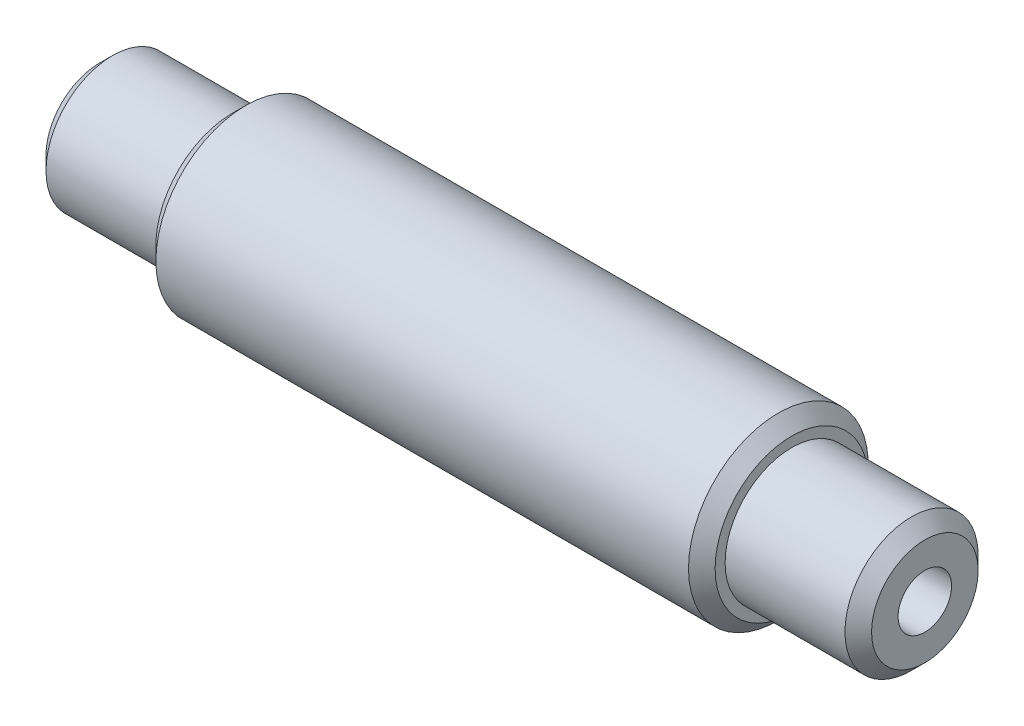
ISO-10303-21;
HEADER;
FILE_DESCRIPTION(('STEP AP214'),'2;1');
FILE_NAME('part.step','',(''),(''),'','','');
FILE_SCHEMA(('AUTOMOTIVE_DESIGN { 1 0 10303 214 1 1 1 1 }'));
ENDSEC;
DATA;
#1=APPLICATION_CONTEXT('core data for automotive mechanical design processes');
#2=APPLICATION_PROTOCOL_DEFINITION('international standard','automotive_design',2000,#1);
#3=PRODUCT_CONTEXT('',#1,'mechanical');
#4=PRODUCT('Part','Part','',(#3));
#5=PRODUCT_RELATED_PRODUCT_CATEGORY('part','',(#4));
#6=PRODUCT_DEFINITION_FORMATION('','',#4);
#7=PRODUCT_DEFINITION_CONTEXT('part definition',#1,'design');
#8=PRODUCT_DEFINITION('design','',#6,#7);
#9=PRODUCT_DEFINITION_SHAPE('','',#8);
#10=(LENGTH_UNIT() NAMED_UNIT(*) SI_UNIT(.MILLI.,.METRE.));
#11=(NAMED_UNIT(*) PLANE_ANGLE_UNIT() SI_UNIT($,.RADIAN.));
#12=(NAMED_UNIT(*) SI_UNIT($,.STERADIAN.) SOLID_ANGLE_UNIT());
#13=UNCERTAINTY_MEASURE_WITH_UNIT(LENGTH_MEASURE(1.E-05),#10,'distance_accuracy_value','');
#14=(GEOMETRIC_REPRESENTATION_CONTEXT(3) GLOBAL_UNCERTAINTY_ASSIGNED_CONTEXT((#13)) GLOBAL_UNIT_ASSIGNED_CONTEXT((#10,
#11,#12)) REPRESENTATION_CONTEXT('',''));
#15=CARTESIAN_POINT('',(0.,0.,0.));
#16=DIRECTION('',(0.,0.,1.));
#17=DIRECTION('',(1.,0.,0.));
#18=AXIS2_PLACEMENT_3D('',#15,#16,#17);
#19=CARTESIAN_POINT('',(-39.37,0.,0.));
#20=DIRECTION('',(1.,0.,0.));
#21=DIRECTION('',(0.,0.,-1.));
#22=AXIS2_PLACEMENT_3D('',#19,#20,#21);
#23=PLANE('',#22);
#24=CARTESIAN_POINT('',(-39.37,0.,0.));
#25=DIRECTION('',(-1.,0.,0.));
#26=DIRECTION('',(0.,0.,1.));
#27=AXIS2_PLACEMENT_3D('',#24,#25,#26);
#28=CIRCLE('',#27,2.55269999999999);
#29=CARTESIAN_POINT('',(-39.37,0.,2.55269999999999));
#30=VERTEX_POINT('',#29);
#31=EDGE_CURVE('E79',#30,#30,#28,.T.);
#32=ORIENTED_EDGE('',*,*,#31,.F.);
#33=EDGE_LOOP('',(#32));
#34=FACE_BOUND('',#33,.T.);
#35=CARTESIAN_POINT('',(-39.37,0.,0.));
#36=DIRECTION('',(1.,0.,0.));
#37=DIRECTION('',(0.,0.,-1.));
#38=AXIS2_PLACEMENT_3D('',#35,#36,#37);
#39=CIRCLE('',#38,5.08000000000002);
#40=CARTESIAN_POINT('',(-39.37,0.,-5.08000000000002));
#41=VERTEX_POINT('',#40);
#42=EDGE_CURVE('E100',#41,#41,#39,.F.);
#43=ORIENTED_EDGE('',*,*,#42,.T.);
#44=EDGE_LOOP('',(#43));
#45=FACE_BOUND('',#44,.T.);
#46=ADVANCED_FACE('F51',(#34,#45),#23,.F.);
#47=CARTESIAN_POINT('',(-113.598773006135,0.,0.));
#48=DIRECTION('',(-1.,0.,0.));
#49=DIRECTION('',(0.,0.,1.));
#50=AXIS2_PLACEMENT_3D('',#47,#48,#49);
#51=CYLINDRICAL_SURFACE('',#50,6.35);
#52=CARTESIAN_POINT('',(-38.1,0.,0.));
#53=DIRECTION('',(1.,0.,0.));
#54=DIRECTION('',(0.,0.,-1.));
#55=AXIS2_PLACEMENT_3D('',#52,#53,#54);
#56=CIRCLE('',#55,6.35);
#57=CARTESIAN_POINT('',(-38.1,0.,-6.35));
#58=VERTEX_POINT('',#57);
#59=EDGE_CURVE('E104',#58,#58,#56,.T.);
#60=ORIENTED_EDGE('',*,*,#59,.T.);
#61=EDGE_LOOP('',(#60));
#62=FACE_BOUND('',#61,.T.);
#63=CARTESIAN_POINT('',(-26.67,0.,0.));
#64=DIRECTION('',(-1.,0.,0.));
#65=DIRECTION('',(0.,0.,1.));
#66=AXIS2_PLACEMENT_3D('',#63,#64,#65);
#67=CIRCLE('',#66,6.35);
#68=CARTESIAN_POINT('',(-26.67,0.,6.35));
#69=VERTEX_POINT('',#68);
#70=EDGE_CURVE('E96',#69,#69,#67,.T.);
#71=ORIENTED_EDGE('',*,*,#70,.T.);
#72=EDGE_LOOP('',(#71));
#73=FACE_BOUND('',#72,.T.);
#74=ADVANCED_FACE('F150',(#62,#73),#51,.T.);
#75=CARTESIAN_POINT('',(-26.67,6.35,0.));
#76=DIRECTION('',(1.,0.,0.));
#77=DIRECTION('',(0.,0.,-1.));
#78=AXIS2_PLACEMENT_3D('',#75,#76,#77);
#79=PLANE('',#78);
#80=CARTESIAN_POINT('',(-26.67,0.,0.));
#81=DIRECTION('',(1.,0.,0.));
#82=DIRECTION('',(0.,0.,-1.));
#83=AXIS2_PLACEMENT_3D('',#80,#81,#82);
#84=CIRCLE('',#83,7.30249999999999);
#85=CARTESIAN_POINT('',(-26.67,0.,-7.30249999999999));
#86=VERTEX_POINT('',#85);
#87=EDGE_CURVE('E11',#86,#86,#84,.F.);
#88=ORIENTED_EDGE('',*,*,#87,.T.);
#89=EDGE_LOOP('',(#88));
#90=FACE_BOUND('',#89,.T.);
#91=ORIENTED_EDGE('',*,*,#70,.F.);
#92=EDGE_LOOP('',(#91));
#93=FACE_BOUND('',#92,.T.);
#94=ADVANCED_FACE('F139',(#90,#93),#79,.F.);
#95=CARTESIAN_POINT('',(-113.598773006135,0.,0.));
#96=DIRECTION('',(-1.,0.,0.));
#97=DIRECTION('',(0.,0.,1.));
#98=AXIS2_PLACEMENT_3D('',#95,#96,#97);
#99=CYLINDRICAL_SURFACE('',#98,8.5725);
#100=CARTESIAN_POINT('',(25.4,0.,0.));
#101=DIRECTION('',(-1.,0.,0.));
#102=DIRECTION('',(0.,0.,1.));
#103=AXIS2_PLACEMENT_3D('',#100,#101,#102);
#104=CIRCLE('',#103,8.5725);
#105=CARTESIAN_POINT('',(25.4,0.,8.5725));
#106=VERTEX_POINT('',#105);
#107=EDGE_CURVE('E120',#106,#106,#104,.T.);
#108=ORIENTED_EDGE('',*,*,#107,.T.);
#109=EDGE_LOOP('',(#108));
#110=FACE_BOUND('',#109,.T.);
#111=CARTESIAN_POINT('',(-25.4,0.,0.));
#112=DIRECTION('',(1.,0.,0.));
#113=DIRECTION('',(0.,0.,-1.));
#114=AXIS2_PLACEMENT_3D('',#111,#112,#113);
#115=CIRCLE('',#114,8.5725);
#116=CARTESIAN_POINT('',(-25.4,0.,-8.5725));
#117=VERTEX_POINT('',#116);
#118=EDGE_CURVE('E116',#117,#117,#115,.T.);
#119=ORIENTED_EDGE('',*,*,#118,.T.);
#120=EDGE_LOOP('',(#119));
#121=FACE_BOUND('',#120,.T.);
#122=ADVANCED_FACE('F136',(#110,#121),#99,.T.);
#123=CARTESIAN_POINT('',(26.67,8.57250000000001,0.));
#124=DIRECTION('',(-1.,0.,0.));
#125=DIRECTION('',(0.,0.,1.));
#126=AXIS2_PLACEMENT_3D('',#123,#124,#125);
#127=PLANE('',#126);
#128=CARTESIAN_POINT('',(26.67,0.,0.));
#129=DIRECTION('',(-1.,0.,0.));
#130=DIRECTION('',(0.,0.,1.));
#131=AXIS2_PLACEMENT_3D('',#128,#129,#130);
#132=CIRCLE('',#131,7.30250000000001);
#133=CARTESIAN_POINT('',(26.67,0.,7.30250000000001));
#134=VERTEX_POINT('',#133);
#135=EDGE_CURVE('E61',#134,#134,#132,.F.);
#136=ORIENTED_EDGE('',*,*,#135,.T.);
#137=EDGE_LOOP('',(#136));
#138=FACE_BOUND('',#137,.T.);
#139=CARTESIAN_POINT('',(26.67,0.,0.));
#140=DIRECTION('',(-1.,0.,0.));
#141=DIRECTION('',(0.,0.,1.));
#142=AXIS2_PLACEMENT_3D('',#139,#140,#141);
#143=CIRCLE('',#142,6.35);
#144=CARTESIAN_POINT('',(26.67,0.,6.35));
#145=VERTEX_POINT('',#144);
#146=EDGE_CURVE('E92',#145,#145,#143,.T.);
#147=ORIENTED_EDGE('',*,*,#146,.T.);
#148=EDGE_LOOP('',(#147));
#149=FACE_BOUND('',#148,.T.);
#150=ADVANCED_FACE('F127',(#138,#149),#127,.F.);
#151=CARTESIAN_POINT('',(-113.598773006135,0.,0.));
#152=DIRECTION('',(-1.,0.,0.));
#153=DIRECTION('',(0.,0.,1.));
#154=AXIS2_PLACEMENT_3D('',#151,#152,#153);
#155=CYLINDRICAL_SURFACE('',#154,6.35);
#156=CARTESIAN_POINT('',(38.1,0.,0.));
#157=DIRECTION('',(-1.,0.,0.));
#158=DIRECTION('',(0.,0.,1.));
#159=AXIS2_PLACEMENT_3D('',#156,#157,#158);
#160=CIRCLE('',#159,6.35);
#161=CARTESIAN_POINT('',(38.1,0.,6.35));
#162=VERTEX_POINT('',#161);
#163=EDGE_CURVE('E108',#162,#162,#160,.T.);
#164=ORIENTED_EDGE('',*,*,#163,.T.);
#165=EDGE_LOOP('',(#164));
#166=FACE_BOUND('',#165,.T.);
#167=ORIENTED_EDGE('',*,*,#146,.F.);
#168=EDGE_LOOP('',(#167));
#169=FACE_BOUND('',#168,.T.);
#170=ADVANCED_FACE('F187',(#166,#169),#155,.T.);
#171=CARTESIAN_POINT('',(39.37,6.35,0.));
#172=DIRECTION('',(-1.,0.,0.));
#173=DIRECTION('',(0.,0.,1.));
#174=AXIS2_PLACEMENT_3D('',#171,#172,#173);
#175=PLANE('',#174);
#176=CARTESIAN_POINT('',(39.37,0.,0.));
#177=DIRECTION('',(1.,0.,0.));
#178=DIRECTION('',(0.,0.,-1.));
#179=AXIS2_PLACEMENT_3D('',#176,#177,#178);
#180=CIRCLE('',#179,2.55269999999999);
#181=CARTESIAN_POINT('',(39.37,0.,-2.55269999999999));
#182=VERTEX_POINT('',#181);
#183=EDGE_CURVE('E78',#182,#182,#180,.T.);
#184=ORIENTED_EDGE('',*,*,#183,.F.);
#185=EDGE_LOOP('',(#184));
#186=FACE_BOUND('',#185,.T.);
#187=CARTESIAN_POINT('',(39.37,0.,0.));
#188=DIRECTION('',(-1.,0.,0.));
#189=DIRECTION('',(0.,0.,1.));
#190=AXIS2_PLACEMENT_3D('',#187,#188,#189);
#191=CIRCLE('',#190,5.08000000000002);
#192=CARTESIAN_POINT('',(39.37,0.,5.08000000000002));
#193=VERTEX_POINT('',#192);
#194=EDGE_CURVE('E112',#193,#193,#191,.F.);
#195=ORIENTED_EDGE('',*,*,#194,.T.);
#196=EDGE_LOOP('',(#195));
#197=FACE_BOUND('',#196,.T.);
#198=ADVANCED_FACE('F170',(#186,#197),#175,.F.);
#199=CARTESIAN_POINT('',(-39.37,0.,0.));
#200=DIRECTION('',(1.,0.,0.));
#201=DIRECTION('',(0.,0.,-1.));
#202=AXIS2_PLACEMENT_3D('',#199,#200,#201);
#203=CONICAL_SURFACE('',#202,5.08000000000002,0.78539816339745);
#204=ORIENTED_EDGE('',*,*,#59,.F.);
#205=EDGE_LOOP('',(#204));
#206=FACE_BOUND('',#205,.T.);
#207=ORIENTED_EDGE('',*,*,#42,.F.);
#208=EDGE_LOOP('',(#207));
#209=FACE_BOUND('',#208,.T.);
#210=ADVANCED_FACE('F164',(#206,#209),#203,.T.);
#211=CARTESIAN_POINT('',(38.1,0.,0.));
#212=DIRECTION('',(-1.,0.,0.));
#213=DIRECTION('',(0.,0.,1.));
#214=AXIS2_PLACEMENT_3D('',#211,#212,#213);
#215=CONICAL_SURFACE('',#214,6.35,0.78539816339745);
#216=ORIENTED_EDGE('',*,*,#194,.F.);
#217=EDGE_LOOP('',(#216));
#218=FACE_BOUND('',#217,.T.);
#219=ORIENTED_EDGE('',*,*,#163,.F.);
#220=EDGE_LOOP('',(#219));
#221=FACE_BOUND('',#220,.T.);
#222=ADVANCED_FACE('F133',(#218,#221),#215,.T.);
#223=CARTESIAN_POINT('',(25.4,0.,0.));
#224=DIRECTION('',(-1.,0.,0.));
#225=DIRECTION('',(0.,0.,1.));
#226=AXIS2_PLACEMENT_3D('',#223,#224,#225);
#227=CONICAL_SURFACE('',#226,8.5725,0.785398163397458);
#228=CARTESIAN_POINT('',(26.67,0.,7.30250000000001));
#229=CARTESIAN_POINT('',(26.6567708333333,0.,7.31572916666668));
#230=CARTESIAN_POINT('',(26.6435416666667,0.,7.32895833333334));
#231=CARTESIAN_POINT('',(26.6170833333333,0.,7.35541666666667));
#232=CARTESIAN_POINT('',(26.6038541666667,0.,7.36864583333334));
#233=CARTESIAN_POINT('',(26.5773958333333,0.,7.39510416666667));
#234=CARTESIAN_POINT('',(26.5641666666667,0.,7.40833333333334));
#235=CARTESIAN_POINT('',(26.5377083333333,0.,7.43479166666667));
#236=CARTESIAN_POINT('',(26.5244791666667,0.,7.44802083333334));
#237=CARTESIAN_POINT('',(26.4980208333333,0.,7.47447916666667));
#238=CARTESIAN_POINT('',(26.4847916666667,0.,7.48770833333334));
#239=CARTESIAN_POINT('',(26.4583333333333,0.,7.51416666666667));
#240=CARTESIAN_POINT('',(26.4451041666667,0.,7.52739583333334));
#241=CARTESIAN_POINT('',(26.4186458333333,0.,7.55385416666667));
#242=CARTESIAN_POINT('',(26.4054166666667,0.,7.56708333333334));
#243=CARTESIAN_POINT('',(26.3789583333333,0.,7.59354166666667));
#244=CARTESIAN_POINT('',(26.3657291666667,0.,7.60677083333334));
#245=CARTESIAN_POINT('',(26.3392708333333,0.,7.63322916666667));
#246=CARTESIAN_POINT('',(26.3260416666667,0.,7.64645833333334));
#247=CARTESIAN_POINT('',(26.2995833333333,0.,7.67291666666667));
#248=CARTESIAN_POINT('',(26.2863541666667,0.,7.68614583333334));
#249=CARTESIAN_POINT('',(26.2598958333333,0.,7.71260416666667));
#250=CARTESIAN_POINT('',(26.2466666666667,0.,7.72583333333334));
#251=CARTESIAN_POINT('',(26.2202083333333,0.,7.75229166666667));
#252=CARTESIAN_POINT('',(26.2069791666667,0.,7.76552083333334));
#253=CARTESIAN_POINT('',(26.1805208333334,0.,7.79197916666667));
#254=CARTESIAN_POINT('',(26.1672916666667,0.,7.80520833333334));
#255=CARTESIAN_POINT('',(26.1408333333334,0.,7.83166666666667));
#256=CARTESIAN_POINT('',(26.1276041666667,0.,7.84489583333334));
#257=CARTESIAN_POINT('',(26.1011458333333,0.,7.87135416666667));
#258=CARTESIAN_POINT('',(26.0879166666667,0.,7.88458333333334));
#259=CARTESIAN_POINT('',(26.0614583333333,0.,7.91104166666667));
#260=CARTESIAN_POINT('',(26.0482291666667,0.,7.92427083333334));
#261=CARTESIAN_POINT('',(26.0217708333334,0.,7.95072916666667));
#262=CARTESIAN_POINT('',(26.0085416666667,0.,7.96395833333334));
#263=CARTESIAN_POINT('',(25.9820833333334,0.,7.99041666666667));
#264=CARTESIAN_POINT('',(25.9688541666667,0.,8.00364583333334));
#265=CARTESIAN_POINT('',(25.9423958333334,0.,8.03010416666667));
#266=CARTESIAN_POINT('',(25.9291666666667,0.,8.04333333333334));
#267=CARTESIAN_POINT('',(25.9027083333334,0.,8.06979166666667));
#268=CARTESIAN_POINT('',(25.8894791666667,0.,8.08302083333334));
#269=CARTESIAN_POINT('',(25.8630208333334,0.,8.10947916666667));
#270=CARTESIAN_POINT('',(25.8497916666667,0.,8.12270833333334));
#271=CARTESIAN_POINT('',(25.8233333333334,0.,8.14916666666667));
#272=CARTESIAN_POINT('',(25.8101041666667,0.,8.16239583333333));
#273=CARTESIAN_POINT('',(25.7836458333334,0.,8.18885416666667));
#274=CARTESIAN_POINT('',(25.7704166666667,0.,8.20208333333334));
#275=CARTESIAN_POINT('',(25.7439583333334,0.,8.22854166666667));
#276=CARTESIAN_POINT('',(25.7307291666667,0.,8.24177083333333));
#277=CARTESIAN_POINT('',(25.7042708333334,0.,8.26822916666667));
#278=CARTESIAN_POINT('',(25.6910416666667,0.,8.28145833333333));
#279=CARTESIAN_POINT('',(25.6645833333334,0.,8.30791666666667));
#280=CARTESIAN_POINT('',(25.6513541666667,0.,8.32114583333333));
#281=CARTESIAN_POINT('',(25.6248958333334,0.,8.34760416666667));
#282=CARTESIAN_POINT('',(25.6116666666667,0.,8.36083333333333));
#283=CARTESIAN_POINT('',(25.5852083333334,0.,8.38729166666667));
#284=CARTESIAN_POINT('',(25.5719791666667,0.,8.40052083333333));
#285=CARTESIAN_POINT('',(25.5455208333334,0.,8.42697916666667));
#286=CARTESIAN_POINT('',(25.5322916666667,0.,8.44020833333333));
#287=CARTESIAN_POINT('',(25.5058333333334,0.,8.46666666666667));
#288=CARTESIAN_POINT('',(25.4926041666667,0.,8.47989583333333));
#289=CARTESIAN_POINT('',(25.4661458333334,0.,8.50635416666667));
#290=CARTESIAN_POINT('',(25.4529166666667,0.,8.51958333333333));
#291=CARTESIAN_POINT('',(25.4264583333334,0.,8.54604166666667));
#292=CARTESIAN_POINT('',(25.4132291666667,0.,8.55927083333333));
#293=CARTESIAN_POINT('',(25.4,0.,8.5725));
#294=B_SPLINE_CURVE_WITH_KNOTS('',3,(#228,#229,#230,#231,#232,#233,#234,#235,#236,#237,#238,
#239,#240,#241,#242,#243,#244,#245,#246,#247,#248,#249,#250,#251,#252,#253,#254,#255,#256,#257,
#258,#259,#260,#261,#262,#263,#264,#265,#266,#267,#268,#269,#270,#271,#272,#273,#274,#275,#276,
#277,#278,#279,#280,#281,#282,#283,#284,#285,#286,#287,#288,#289,#290,#291,#292,#293),
.UNSPECIFIED.,.F.,.F.,(4,2,2,2,2,2,2,2,2,2,2,2,2,2,2,2,2,2,2,2,2,2,2,2,2,2,2,2,2,2,2,2,4),(0.,
0.0561266007566819,0.112253201513363,0.168379802270045,0.224506403026725,0.280633003783406,
0.336759604540088,0.39288620529677,0.44901280605345,0.505139406810131,0.561266007566813,
0.617392608323495,0.673519209080174,0.729645809836856,0.785772410593538,0.84189901135022,
0.898025612106899,0.954152212863581,1.01027881362026,1.06640541437695,1.12253201513362,
1.17865861589031,1.23478521664699,1.29091181740367,1.34703841816035,1.40316501891703,
1.45929161967371,1.51541822043039,1.57154482118708,1.62767142194376,1.68379802270044,
1.73992462345712,1.7960512242138),.UNSPECIFIED.);
#295=EDGE_CURVE('BSEAM130',#134,#106,#294,.T.);
#296=ORIENTED_EDGE('',*,*,#135,.F.);
#297=ORIENTED_EDGE('',*,*,#107,.F.);
#298=ORIENTED_EDGE('',*,*,#295,.T.);
#299=ORIENTED_EDGE('',*,*,#295,.F.);
#300=EDGE_LOOP('',(#296,#298,#297,#299));
#301=FACE_BOUND('',#300,.T.);
#302=ADVANCED_FACE('F130',(#301),#227,.T.);
#303=CARTESIAN_POINT('',(-26.67,0.,0.));
#304=DIRECTION('',(1.,0.,0.));
#305=DIRECTION('',(0.,0.,-1.));
#306=AXIS2_PLACEMENT_3D('',#303,#304,#305);
#307=CONICAL_SURFACE('',#306,7.30249999999999,0.785398163397444);
#308=ORIENTED_EDGE('',*,*,#118,.F.);
#309=EDGE_LOOP('',(#308));
#310=FACE_BOUND('',#309,.T.);
#311=ORIENTED_EDGE('',*,*,#87,.F.);
#312=EDGE_LOOP('',(#311));
#313=FACE_BOUND('',#312,.T.);
#314=ADVANCED_FACE('F54',(#310,#313),#307,.T.);
#315=CARTESIAN_POINT('',(13.97,0.,0.));
#316=DIRECTION('',(1.,0.,0.));
#317=DIRECTION('',(0.,0.,-1.));
#318=AXIS2_PLACEMENT_3D('',#315,#316,#317);
#319=CONICAL_SURFACE('',#318,2.55269999999999,1.02974425867665);
#320=CARTESIAN_POINT('',(12.4361830978083,0.,0.));
#321=VERTEX_POINT('',#320);
#322=VERTEX_LOOP('',#321);
#323=FACE_BOUND('',#322,.T.);
#324=CARTESIAN_POINT('',(13.97,0.,0.));
#325=DIRECTION('',(1.,0.,0.));
#326=DIRECTION('',(0.,0.,-1.));
#327=AXIS2_PLACEMENT_3D('',#324,#325,#326);
#328=CIRCLE('',#327,2.55269999999999);
#329=CARTESIAN_POINT('',(13.97,0.,-2.55269999999999));
#330=VERTEX_POINT('',#329);
#331=EDGE_CURVE('E84',#330,#330,#328,.T.);
#332=ORIENTED_EDGE('',*,*,#331,.T.);
#333=EDGE_LOOP('',(#332));
#334=FACE_BOUND('',#333,.T.);
#335=ADVANCED_FACE('F145',(#323,#334),#319,.F.);
#336=CARTESIAN_POINT('',(39.37,0.,0.));
#337=DIRECTION('',(1.,0.,0.));
#338=DIRECTION('',(0.,0.,-1.));
#339=AXIS2_PLACEMENT_3D('',#336,#337,#338);
#340=CYLINDRICAL_SURFACE('',#339,2.55269999999999);
#341=ORIENTED_EDGE('',*,*,#331,.F.);
#342=EDGE_LOOP('',(#341));
#343=FACE_BOUND('',#342,.T.);
#344=ORIENTED_EDGE('',*,*,#183,.T.);
#345=EDGE_LOOP('',(#344));
#346=FACE_BOUND('',#345,.T.);
#347=ADVANCED_FACE('F71',(#343,#346),#340,.F.);
#348=CARTESIAN_POINT('',(-13.97,0.,0.));
#349=DIRECTION('',(-1.,0.,0.));
#350=DIRECTION('',(0.,0.,1.));
#351=AXIS2_PLACEMENT_3D('',#348,#349,#350);
#352=CONICAL_SURFACE('',#351,2.55269999999999,1.02974425867665);
#353=CARTESIAN_POINT('',(-12.4361830978083,0.,0.));
#354=VERTEX_POINT('',#353);
#355=VERTEX_LOOP('',#354);
#356=FACE_BOUND('',#355,.T.);
#357=CARTESIAN_POINT('',(-13.97,0.,0.));
#358=DIRECTION('',(-1.,0.,0.));
#359=DIRECTION('',(0.,0.,1.));
#360=AXIS2_PLACEMENT_3D('',#357,#358,#359);
#361=CIRCLE('',#360,2.55269999999999);
#362=CARTESIAN_POINT('',(-13.97,0.,2.55269999999999));
#363=VERTEX_POINT('',#362);
#364=EDGE_CURVE('E75',#363,#363,#361,.T.);
#365=ORIENTED_EDGE('',*,*,#364,.T.);
#366=EDGE_LOOP('',(#365));
#367=FACE_BOUND('',#366,.T.);
#368=ADVANCED_FACE('F67',(#356,#367),#352,.F.);
#369=CARTESIAN_POINT('',(-39.37,0.,0.));
#370=DIRECTION('',(-1.,0.,0.));
#371=DIRECTION('',(0.,0.,1.));
#372=AXIS2_PLACEMENT_3D('',#369,#370,#371);
#373=CYLINDRICAL_SURFACE('',#372,2.55269999999999);
#374=ORIENTED_EDGE('',*,*,#364,.F.);
#375=EDGE_LOOP('',(#374));
#376=FACE_BOUND('',#375,.T.);
#377=ORIENTED_EDGE('',*,*,#31,.T.);
#378=EDGE_LOOP('',(#377));
#379=FACE_BOUND('',#378,.T.);
#380=ADVANCED_FACE('F70',(#376,#379),#373,.F.);
#381=CLOSED_SHELL('',(#46,#74,#94,#122,#150,#170,#198,#210,#222,#302,#314,#335,#347,#368,#380));
#382=MANIFOLD_SOLID_BREP('B2',#381);
#383=ADVANCED_BREP_SHAPE_REPRESENTATION('',(#18,#382),#14);
#384=SHAPE_DEFINITION_REPRESENTATION(#9,#383);
ENDSEC;
END-ISO-10303-21;
